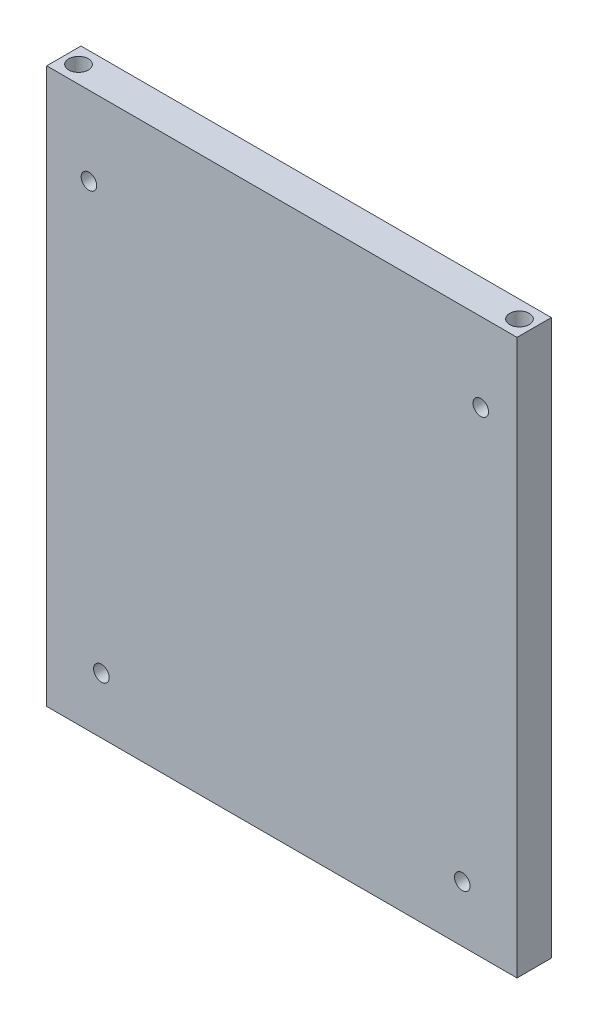
ISO-10303-21;
HEADER;
FILE_DESCRIPTION(('STEP AP214'),'2;1');
FILE_NAME('part.step','',(''),(''),'','','');
FILE_SCHEMA(('AUTOMOTIVE_DESIGN { 1 0 10303 214 1 1 1 1 }'));
ENDSEC;
DATA;
#1=APPLICATION_CONTEXT('core data for automotive mechanical design processes');
#2=APPLICATION_PROTOCOL_DEFINITION('international standard','automotive_design',2000,#1);
#3=PRODUCT_CONTEXT('',#1,'mechanical');
#4=PRODUCT('Part','Part','',(#3));
#5=PRODUCT_RELATED_PRODUCT_CATEGORY('part','',(#4));
#6=PRODUCT_DEFINITION_FORMATION('','',#4);
#7=PRODUCT_DEFINITION_CONTEXT('part definition',#1,'design');
#8=PRODUCT_DEFINITION('design','',#6,#7);
#9=PRODUCT_DEFINITION_SHAPE('','',#8);
#10=(LENGTH_UNIT() NAMED_UNIT(*) SI_UNIT(.MILLI.,.METRE.));
#11=(NAMED_UNIT(*) PLANE_ANGLE_UNIT() SI_UNIT($,.RADIAN.));
#12=(NAMED_UNIT(*) SI_UNIT($,.STERADIAN.) SOLID_ANGLE_UNIT());
#13=UNCERTAINTY_MEASURE_WITH_UNIT(LENGTH_MEASURE(1.E-05),#10,'distance_accuracy_value','');
#14=(GEOMETRIC_REPRESENTATION_CONTEXT(3) GLOBAL_UNCERTAINTY_ASSIGNED_CONTEXT((#13)) GLOBAL_UNIT_ASSIGNED_CONTEXT((#10,
#11,#12)) REPRESENTATION_CONTEXT('',''));
#15=CARTESIAN_POINT('',(0.,0.,0.));
#16=DIRECTION('',(0.,0.,1.));
#17=DIRECTION('',(1.,0.,0.));
#18=AXIS2_PLACEMENT_3D('',#15,#16,#17);
#19=CARTESIAN_POINT('',(-160.864898462847,98.9878632478632,7.));
#20=DIRECTION('',(1.,0.,0.));
#21=DIRECTION('',(0.,1.,0.));
#22=AXIS2_PLACEMENT_3D('',#19,#20,#21);
#23=PLANE('',#22);
#24=DIRECTION('',(0.,-1.,0.));
#25=VECTOR('',#24,1.);
#26=CARTESIAN_POINT('',(-160.864898462847,98.9878632478632,0.));
#27=LINE('',#26,#25);
#28=CARTESIAN_POINT('',(-160.864898462847,98.9878632478632,0.));
#29=VERTEX_POINT('',#28);
#30=CARTESIAN_POINT('',(-160.864898462847,-14.2521367521368,0.));
#31=VERTEX_POINT('',#30);
#32=EDGE_CURVE('E101',#29,#31,#27,.T.);
#33=ORIENTED_EDGE('',*,*,#32,.T.);
#34=DIRECTION('',(0.,0.,-1.));
#35=VECTOR('',#34,1.);
#36=CARTESIAN_POINT('',(-160.864898462847,-14.2521367521368,7.));
#37=LINE('',#36,#35);
#38=CARTESIAN_POINT('',(-160.864898462847,-14.2521367521368,7.));
#39=VERTEX_POINT('',#38);
#40=EDGE_CURVE('E11',#39,#31,#37,.T.);
#41=ORIENTED_EDGE('',*,*,#40,.F.);
#42=DIRECTION('',(0.,-1.,0.));
#43=VECTOR('',#42,1.);
#44=CARTESIAN_POINT('',(-160.864898462847,98.9878632478632,7.));
#45=LINE('',#44,#43);
#46=CARTESIAN_POINT('',(-160.864898462847,98.9878632478632,7.));
#47=VERTEX_POINT('',#46);
#48=EDGE_CURVE('E88',#47,#39,#45,.T.);
#49=ORIENTED_EDGE('',*,*,#48,.F.);
#50=DIRECTION('',(0.,0.,-1.));
#51=VECTOR('',#50,1.);
#52=CARTESIAN_POINT('',(-160.864898462847,98.9878632478632,7.));
#53=LINE('',#52,#51);
#54=EDGE_CURVE('E97',#47,#29,#53,.T.);
#55=ORIENTED_EDGE('',*,*,#54,.T.);
#56=EDGE_LOOP('',(#33,#41,#49,#55));
#57=FACE_BOUND('',#56,.T.);
#58=ADVANCED_FACE('F35',(#57),#23,.F.);
#59=CARTESIAN_POINT('',(-160.864898462847,-14.2521367521368,7.));
#60=DIRECTION('',(0.,1.,0.));
#61=DIRECTION('',(0.,0.,1.));
#62=AXIS2_PLACEMENT_3D('',#59,#60,#61);
#63=PLANE('',#62);
#64=CARTESIAN_POINT('',(-67.8648984628471,-14.2521367521368,3.5));
#65=DIRECTION('',(0.,1.,0.));
#66=DIRECTION('',(0.,0.,1.));
#67=AXIS2_PLACEMENT_3D('',#64,#65,#66);
#68=CIRCLE('',#67,2.);
#69=CARTESIAN_POINT('',(-67.8648984628471,-14.2521367521368,5.5));
#70=VERTEX_POINT('',#69);
#71=EDGE_CURVE('E241',#70,#70,#68,.T.);
#72=ORIENTED_EDGE('',*,*,#71,.T.);
#73=EDGE_LOOP('',(#72));
#74=FACE_BOUND('',#73,.T.);
#75=CARTESIAN_POINT('',(-157.864898462847,-14.2521367521368,3.5));
#76=DIRECTION('',(0.,1.,0.));
#77=DIRECTION('',(0.,0.,1.));
#78=AXIS2_PLACEMENT_3D('',#75,#76,#77);
#79=CIRCLE('',#78,2.);
#80=CARTESIAN_POINT('',(-157.864898462847,-14.2521367521368,5.5));
#81=VERTEX_POINT('',#80);
#82=EDGE_CURVE('E245',#81,#81,#79,.T.);
#83=ORIENTED_EDGE('',*,*,#82,.T.);
#84=EDGE_LOOP('',(#83));
#85=FACE_BOUND('',#84,.T.);
#86=DIRECTION('',(1.,0.,0.));
#87=VECTOR('',#86,1.);
#88=CARTESIAN_POINT('',(-160.864898462847,-14.2521367521368,0.));
#89=LINE('',#88,#87);
#90=CARTESIAN_POINT('',(-64.8648984628471,-14.2521367521368,0.));
#91=VERTEX_POINT('',#90);
#92=EDGE_CURVE('E92',#31,#91,#89,.T.);
#93=ORIENTED_EDGE('',*,*,#92,.T.);
#94=DIRECTION('',(0.,0.,-1.));
#95=VECTOR('',#94,1.);
#96=CARTESIAN_POINT('',(-64.8648984628471,-14.2521367521368,7.));
#97=LINE('',#96,#95);
#98=CARTESIAN_POINT('',(-64.8648984628471,-14.2521367521368,7.));
#99=VERTEX_POINT('',#98);
#100=EDGE_CURVE('E44',#99,#91,#97,.T.);
#101=ORIENTED_EDGE('',*,*,#100,.F.);
#102=DIRECTION('',(1.,0.,0.));
#103=VECTOR('',#102,1.);
#104=CARTESIAN_POINT('',(-160.864898462847,-14.2521367521368,7.));
#105=LINE('',#104,#103);
#106=EDGE_CURVE('E83',#39,#99,#105,.T.);
#107=ORIENTED_EDGE('',*,*,#106,.F.);
#108=ORIENTED_EDGE('',*,*,#40,.T.);
#109=EDGE_LOOP('',(#93,#101,#107,#108));
#110=FACE_BOUND('',#109,.T.);
#111=ADVANCED_FACE('F91',(#74,#85,#110),#63,.F.);
#112=CARTESIAN_POINT('',(-64.8648984628471,98.9878632478632,7.));
#113=DIRECTION('',(-1.,0.,0.));
#114=DIRECTION('',(0.,-1.,0.));
#115=AXIS2_PLACEMENT_3D('',#112,#113,#114);
#116=PLANE('',#115);
#117=DIRECTION('',(0.,1.,0.));
#118=VECTOR('',#117,1.);
#119=CARTESIAN_POINT('',(-64.8648984628471,98.9878632478632,0.));
#120=LINE('',#119,#118);
#121=CARTESIAN_POINT('',(-64.8648984628471,98.9878632478632,0.));
#122=VERTEX_POINT('',#121);
#123=EDGE_CURVE('E70',#91,#122,#120,.T.);
#124=ORIENTED_EDGE('',*,*,#123,.T.);
#125=DIRECTION('',(0.,0.,-1.));
#126=VECTOR('',#125,1.);
#127=CARTESIAN_POINT('',(-64.8648984628471,98.9878632478632,7.));
#128=LINE('',#127,#126);
#129=CARTESIAN_POINT('',(-64.8648984628471,98.9878632478632,7.));
#130=VERTEX_POINT('',#129);
#131=EDGE_CURVE('E93',#130,#122,#128,.T.);
#132=ORIENTED_EDGE('',*,*,#131,.F.);
#133=DIRECTION('',(0.,1.,0.));
#134=VECTOR('',#133,1.);
#135=CARTESIAN_POINT('',(-64.8648984628471,98.9878632478632,7.));
#136=LINE('',#135,#134);
#137=EDGE_CURVE('E86',#99,#130,#136,.T.);
#138=ORIENTED_EDGE('',*,*,#137,.F.);
#139=ORIENTED_EDGE('',*,*,#100,.T.);
#140=EDGE_LOOP('',(#124,#132,#138,#139));
#141=FACE_BOUND('',#140,.T.);
#142=ADVANCED_FACE('F95',(#141),#116,.F.);
#143=CARTESIAN_POINT('',(-160.864898462847,98.9878632478632,7.));
#144=DIRECTION('',(0.,-1.,0.));
#145=DIRECTION('',(0.,0.,-1.));
#146=AXIS2_PLACEMENT_3D('',#143,#144,#145);
#147=PLANE('',#146);
#148=CARTESIAN_POINT('',(-67.8648984628471,98.9878632478632,3.5));
#149=DIRECTION('',(0.,1.,0.));
#150=DIRECTION('',(0.,0.,1.));
#151=AXIS2_PLACEMENT_3D('',#148,#149,#150);
#152=CIRCLE('',#151,2.);
#153=CARTESIAN_POINT('',(-67.8648984628471,98.9878632478632,5.5));
#154=VERTEX_POINT('',#153);
#155=EDGE_CURVE('E244',#154,#154,#152,.T.);
#156=ORIENTED_EDGE('',*,*,#155,.F.);
#157=EDGE_LOOP('',(#156));
#158=FACE_BOUND('',#157,.T.);
#159=CARTESIAN_POINT('',(-157.864898462847,98.9878632478632,3.5));
#160=DIRECTION('',(0.,1.,0.));
#161=DIRECTION('',(0.,0.,1.));
#162=AXIS2_PLACEMENT_3D('',#159,#160,#161);
#163=CIRCLE('',#162,2.);
#164=CARTESIAN_POINT('',(-157.864898462847,98.9878632478632,5.5));
#165=VERTEX_POINT('',#164);
#166=EDGE_CURVE('E250',#165,#165,#163,.T.);
#167=ORIENTED_EDGE('',*,*,#166,.F.);
#168=EDGE_LOOP('',(#167));
#169=FACE_BOUND('',#168,.T.);
#170=DIRECTION('',(-1.,0.,0.));
#171=VECTOR('',#170,1.);
#172=CARTESIAN_POINT('',(-160.864898462847,98.9878632478632,0.));
#173=LINE('',#172,#171);
#174=EDGE_CURVE('E76',#122,#29,#173,.T.);
#175=ORIENTED_EDGE('',*,*,#174,.T.);
#176=ORIENTED_EDGE('',*,*,#54,.F.);
#177=DIRECTION('',(-1.,0.,0.));
#178=VECTOR('',#177,1.);
#179=CARTESIAN_POINT('',(-160.864898462847,98.9878632478632,7.));
#180=LINE('',#179,#178);
#181=EDGE_CURVE('E53',#130,#47,#180,.T.);
#182=ORIENTED_EDGE('',*,*,#181,.F.);
#183=ORIENTED_EDGE('',*,*,#131,.T.);
#184=EDGE_LOOP('',(#175,#176,#182,#183));
#185=FACE_BOUND('',#184,.T.);
#186=ADVANCED_FACE('F159',(#158,#169,#185),#147,.F.);
#187=CARTESIAN_POINT('',(0.,0.,7.));
#188=DIRECTION('',(0.,0.,1.));
#189=DIRECTION('',(1.,0.,0.));
#190=AXIS2_PLACEMENT_3D('',#187,#188,#189);
#191=PLANE('',#190);
#192=CARTESIAN_POINT('',(-72.2648984628472,82.8994565756793,7.));
#193=DIRECTION('',(0.,0.,1.));
#194=DIRECTION('',(1.,0.,0.));
#195=AXIS2_PLACEMENT_3D('',#192,#193,#194);
#196=CIRCLE('',#195,1.59);
#197=CARTESIAN_POINT('',(-70.6748984628472,82.8994565756793,7.));
#198=VERTEX_POINT('',#197);
#199=EDGE_CURVE('E258',#198,#198,#196,.T.);
#200=ORIENTED_EDGE('',*,*,#199,.F.);
#201=EDGE_LOOP('',(#200));
#202=FACE_BOUND('',#201,.T.);
#203=CARTESIAN_POINT('',(-149.694898462847,-2.79290772826558,7.));
#204=DIRECTION('',(0.,0.,1.));
#205=DIRECTION('',(1.,0.,0.));
#206=AXIS2_PLACEMENT_3D('',#203,#204,#205);
#207=CIRCLE('',#206,1.59000000000001);
#208=CARTESIAN_POINT('',(-148.104898462847,-2.79290772826558,7.));
#209=VERTEX_POINT('',#208);
#210=EDGE_CURVE('E257',#209,#209,#207,.T.);
#211=ORIENTED_EDGE('',*,*,#210,.F.);
#212=EDGE_LOOP('',(#211));
#213=FACE_BOUND('',#212,.T.);
#214=CARTESIAN_POINT('',(-76.0348984628472,-2.79290772826558,7.));
#215=DIRECTION('',(0.,0.,1.));
#216=DIRECTION('',(1.,0.,0.));
#217=AXIS2_PLACEMENT_3D('',#214,#215,#216);
#218=CIRCLE('',#217,1.58999999999999);
#219=CARTESIAN_POINT('',(-74.4448984628472,-2.79290772826558,7.));
#220=VERTEX_POINT('',#219);
#221=EDGE_CURVE('E247',#220,#220,#218,.T.);
#222=ORIENTED_EDGE('',*,*,#221,.F.);
#223=EDGE_LOOP('',(#222));
#224=FACE_BOUND('',#223,.T.);
#225=CARTESIAN_POINT('',(-152.234898462847,82.8994565756793,7.));
#226=DIRECTION('',(0.,0.,1.));
#227=DIRECTION('',(1.,0.,0.));
#228=AXIS2_PLACEMENT_3D('',#225,#226,#227);
#229=CIRCLE('',#228,1.59000000000001);
#230=CARTESIAN_POINT('',(-150.644898462847,82.8994565756793,7.));
#231=VERTEX_POINT('',#230);
#232=EDGE_CURVE('E113',#231,#231,#229,.T.);
#233=ORIENTED_EDGE('',*,*,#232,.F.);
#234=EDGE_LOOP('',(#233));
#235=FACE_BOUND('',#234,.T.);
#236=ORIENTED_EDGE('',*,*,#48,.T.);
#237=ORIENTED_EDGE('',*,*,#106,.T.);
#238=ORIENTED_EDGE('',*,*,#137,.T.);
#239=ORIENTED_EDGE('',*,*,#181,.T.);
#240=EDGE_LOOP('',(#236,#237,#238,#239));
#241=FACE_BOUND('',#240,.T.);
#242=ADVANCED_FACE('F84',(#202,#213,#224,#235,#241),#191,.T.);
#243=CARTESIAN_POINT('',(0.,0.,0.));
#244=DIRECTION('',(0.,0.,1.));
#245=DIRECTION('',(1.,0.,0.));
#246=AXIS2_PLACEMENT_3D('',#243,#244,#245);
#247=PLANE('',#246);
#248=CARTESIAN_POINT('',(-72.2648984628472,82.8994565756793,0.));
#249=DIRECTION('',(0.,0.,1.));
#250=DIRECTION('',(1.,0.,0.));
#251=AXIS2_PLACEMENT_3D('',#248,#249,#250);
#252=CIRCLE('',#251,1.59);
#253=CARTESIAN_POINT('',(-70.6748984628472,82.8994565756793,0.));
#254=VERTEX_POINT('',#253);
#255=EDGE_CURVE('E38',#254,#254,#252,.T.);
#256=ORIENTED_EDGE('',*,*,#255,.T.);
#257=EDGE_LOOP('',(#256));
#258=FACE_BOUND('',#257,.T.);
#259=CARTESIAN_POINT('',(-149.694898462847,-2.79290772826558,0.));
#260=DIRECTION('',(0.,0.,1.));
#261=DIRECTION('',(1.,0.,0.));
#262=AXIS2_PLACEMENT_3D('',#259,#260,#261);
#263=CIRCLE('',#262,1.59000000000001);
#264=CARTESIAN_POINT('',(-148.104898462847,-2.79290772826558,0.));
#265=VERTEX_POINT('',#264);
#266=EDGE_CURVE('E115',#265,#265,#263,.T.);
#267=ORIENTED_EDGE('',*,*,#266,.T.);
#268=EDGE_LOOP('',(#267));
#269=FACE_BOUND('',#268,.T.);
#270=CARTESIAN_POINT('',(-76.0348984628472,-2.79290772826558,0.));
#271=DIRECTION('',(0.,0.,1.));
#272=DIRECTION('',(1.,0.,0.));
#273=AXIS2_PLACEMENT_3D('',#270,#271,#272);
#274=CIRCLE('',#273,1.58999999999999);
#275=CARTESIAN_POINT('',(-74.4448984628472,-2.79290772826558,0.));
#276=VERTEX_POINT('',#275);
#277=EDGE_CURVE('E112',#276,#276,#274,.T.);
#278=ORIENTED_EDGE('',*,*,#277,.T.);
#279=EDGE_LOOP('',(#278));
#280=FACE_BOUND('',#279,.T.);
#281=CARTESIAN_POINT('',(-152.234898462847,82.8994565756793,0.));
#282=DIRECTION('',(0.,0.,1.));
#283=DIRECTION('',(1.,0.,0.));
#284=AXIS2_PLACEMENT_3D('',#281,#282,#283);
#285=CIRCLE('',#284,1.59000000000001);
#286=CARTESIAN_POINT('',(-150.644898462847,82.8994565756793,0.));
#287=VERTEX_POINT('',#286);
#288=EDGE_CURVE('E109',#287,#287,#285,.T.);
#289=ORIENTED_EDGE('',*,*,#288,.T.);
#290=EDGE_LOOP('',(#289));
#291=FACE_BOUND('',#290,.T.);
#292=ORIENTED_EDGE('',*,*,#32,.F.);
#293=ORIENTED_EDGE('',*,*,#174,.F.);
#294=ORIENTED_EDGE('',*,*,#123,.F.);
#295=ORIENTED_EDGE('',*,*,#92,.F.);
#296=EDGE_LOOP('',(#292,#293,#294,#295));
#297=FACE_BOUND('',#296,.T.);
#298=ADVANCED_FACE('F122',(#258,#269,#280,#291,#297),#247,.F.);
#299=CARTESIAN_POINT('',(-152.234898462847,82.8994565756793,-3.));
#300=DIRECTION('',(0.,0.,1.));
#301=DIRECTION('',(1.,0.,0.));
#302=AXIS2_PLACEMENT_3D('',#299,#300,#301);
#303=CYLINDRICAL_SURFACE('',#302,1.59000000000001);
#304=ORIENTED_EDGE('',*,*,#232,.T.);
#305=EDGE_LOOP('',(#304));
#306=FACE_BOUND('',#305,.T.);
#307=ORIENTED_EDGE('',*,*,#288,.F.);
#308=EDGE_LOOP('',(#307));
#309=FACE_BOUND('',#308,.T.);
#310=ADVANCED_FACE('F151',(#306,#309),#303,.F.);
#311=CARTESIAN_POINT('',(-76.0348984628472,-2.79290772826558,-3.));
#312=DIRECTION('',(0.,0.,1.));
#313=DIRECTION('',(1.,0.,0.));
#314=AXIS2_PLACEMENT_3D('',#311,#312,#313);
#315=CYLINDRICAL_SURFACE('',#314,1.58999999999999);
#316=ORIENTED_EDGE('',*,*,#221,.T.);
#317=EDGE_LOOP('',(#316));
#318=FACE_BOUND('',#317,.T.);
#319=ORIENTED_EDGE('',*,*,#277,.F.);
#320=EDGE_LOOP('',(#319));
#321=FACE_BOUND('',#320,.T.);
#322=ADVANCED_FACE('F137',(#318,#321),#315,.F.);
#323=CARTESIAN_POINT('',(-149.694898462847,-2.79290772826558,-3.));
#324=DIRECTION('',(0.,0.,1.));
#325=DIRECTION('',(1.,0.,0.));
#326=AXIS2_PLACEMENT_3D('',#323,#324,#325);
#327=CYLINDRICAL_SURFACE('',#326,1.59000000000001);
#328=ORIENTED_EDGE('',*,*,#210,.T.);
#329=EDGE_LOOP('',(#328));
#330=FACE_BOUND('',#329,.T.);
#331=ORIENTED_EDGE('',*,*,#266,.F.);
#332=EDGE_LOOP('',(#331));
#333=FACE_BOUND('',#332,.T.);
#334=ADVANCED_FACE('F127',(#330,#333),#327,.F.);
#335=CARTESIAN_POINT('',(-72.2648984628472,82.8994565756793,-3.));
#336=DIRECTION('',(0.,0.,1.));
#337=DIRECTION('',(1.,0.,0.));
#338=AXIS2_PLACEMENT_3D('',#335,#336,#337);
#339=CYLINDRICAL_SURFACE('',#338,1.59);
#340=ORIENTED_EDGE('',*,*,#199,.T.);
#341=EDGE_LOOP('',(#340));
#342=FACE_BOUND('',#341,.T.);
#343=ORIENTED_EDGE('',*,*,#255,.F.);
#344=EDGE_LOOP('',(#343));
#345=FACE_BOUND('',#344,.T.);
#346=ADVANCED_FACE('F124',(#342,#345),#339,.F.);
#347=CARTESIAN_POINT('',(-157.864898462847,-14.2521367521368,3.5));
#348=DIRECTION('',(0.,1.,0.));
#349=DIRECTION('',(0.,0.,1.));
#350=AXIS2_PLACEMENT_3D('',#347,#348,#349);
#351=CYLINDRICAL_SURFACE('',#350,2.);
#352=ORIENTED_EDGE('',*,*,#82,.F.);
#353=EDGE_LOOP('',(#352));
#354=FACE_BOUND('',#353,.T.);
#355=ORIENTED_EDGE('',*,*,#166,.T.);
#356=EDGE_LOOP('',(#355));
#357=FACE_BOUND('',#356,.T.);
#358=ADVANCED_FACE('F126',(#354,#357),#351,.F.);
#359=CARTESIAN_POINT('',(-67.8648984628471,-14.2521367521368,3.5));
#360=DIRECTION('',(0.,1.,0.));
#361=DIRECTION('',(0.,0.,1.));
#362=AXIS2_PLACEMENT_3D('',#359,#360,#361);
#363=CYLINDRICAL_SURFACE('',#362,2.);
#364=ORIENTED_EDGE('',*,*,#71,.F.);
#365=EDGE_LOOP('',(#364));
#366=FACE_BOUND('',#365,.T.);
#367=ORIENTED_EDGE('',*,*,#155,.T.);
#368=EDGE_LOOP('',(#367));
#369=FACE_BOUND('',#368,.T.);
#370=ADVANCED_FACE('F134',(#366,#369),#363,.F.);
#371=CLOSED_SHELL('',(#58,#111,#142,#186,#242,#298,#310,#322,#334,#346,#358,#370));
#372=MANIFOLD_SOLID_BREP('B2',#371);
#373=ADVANCED_BREP_SHAPE_REPRESENTATION('',(#18,#372),#14);
#374=SHAPE_DEFINITION_REPRESENTATION(#9,#373);
ENDSEC;
END-ISO-10303-21;
